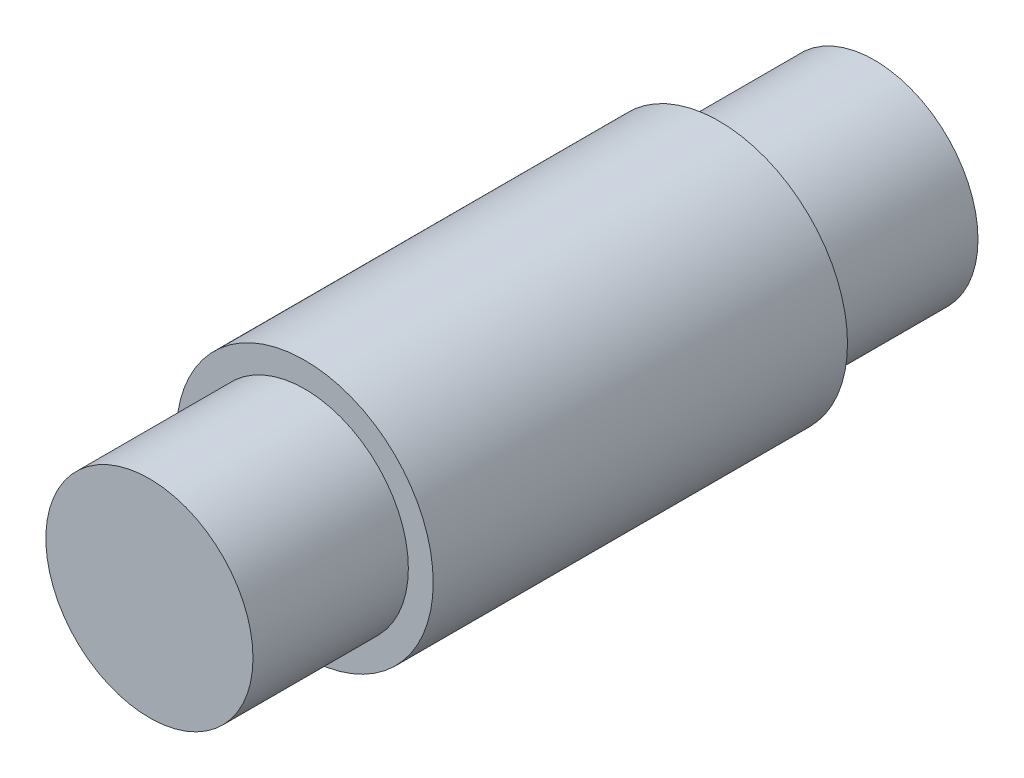
ISO-10303-21;
HEADER;
FILE_DESCRIPTION(('STEP AP214'),'2;1');
FILE_NAME('part.step','',(''),(''),'','','');
FILE_SCHEMA(('AUTOMOTIVE_DESIGN { 1 0 10303 214 1 1 1 1 }'));
ENDSEC;
DATA;
#1=APPLICATION_CONTEXT('core data for automotive mechanical design processes');
#2=APPLICATION_PROTOCOL_DEFINITION('international standard','automotive_design',2000,#1);
#3=PRODUCT_CONTEXT('',#1,'mechanical');
#4=PRODUCT('Part','Part','',(#3));
#5=PRODUCT_RELATED_PRODUCT_CATEGORY('part','',(#4));
#6=PRODUCT_DEFINITION_FORMATION('','',#4);
#7=PRODUCT_DEFINITION_CONTEXT('part definition',#1,'design');
#8=PRODUCT_DEFINITION('design','',#6,#7);
#9=PRODUCT_DEFINITION_SHAPE('','',#8);
#10=(LENGTH_UNIT() NAMED_UNIT(*) SI_UNIT(.MILLI.,.METRE.));
#11=(NAMED_UNIT(*) PLANE_ANGLE_UNIT() SI_UNIT($,.RADIAN.));
#12=(NAMED_UNIT(*) SI_UNIT($,.STERADIAN.) SOLID_ANGLE_UNIT());
#13=UNCERTAINTY_MEASURE_WITH_UNIT(LENGTH_MEASURE(1.E-05),#10,'distance_accuracy_value','');
#14=(GEOMETRIC_REPRESENTATION_CONTEXT(3) GLOBAL_UNCERTAINTY_ASSIGNED_CONTEXT((#13)) GLOBAL_UNIT_ASSIGNED_CONTEXT((#10,
#11,#12)) REPRESENTATION_CONTEXT('',''));
#15=CARTESIAN_POINT('',(0.,0.,0.));
#16=DIRECTION('',(0.,0.,1.));
#17=DIRECTION('',(1.,0.,0.));
#18=AXIS2_PLACEMENT_3D('',#15,#16,#17);
#19=CARTESIAN_POINT('',(-3.175,0.,0.));
#20=DIRECTION('',(0.,0.,-1.));
#21=DIRECTION('',(-1.,0.,0.));
#22=AXIS2_PLACEMENT_3D('',#19,#20,#21);
#23=PLANE('',#22);
#24=CARTESIAN_POINT('',(-3.175,0.,0.));
#25=DIRECTION('',(0.,0.,1.));
#26=DIRECTION('',(1.,0.,0.));
#27=AXIS2_PLACEMENT_3D('',#24,#25,#26);
#28=CIRCLE('',#27,3.175);
#29=CARTESIAN_POINT('',(0.,0.,0.));
#30=VERTEX_POINT('',#29);
#31=EDGE_CURVE('E10',#30,#30,#28,.T.);
#32=ORIENTED_EDGE('',*,*,#31,.F.);
#33=EDGE_LOOP('',(#32));
#34=FACE_BOUND('',#33,.T.);
#35=ADVANCED_FACE('F31',(#34),#23,.T.);
#36=CARTESIAN_POINT('',(-3.175,0.,22.225));
#37=DIRECTION('',(0.,0.,1.));
#38=DIRECTION('',(1.,0.,0.));
#39=AXIS2_PLACEMENT_3D('',#36,#37,#38);
#40=CYLINDRICAL_SURFACE('',#39,3.175);
#41=ORIENTED_EDGE('',*,*,#31,.T.);
#42=EDGE_LOOP('',(#41));
#43=FACE_BOUND('',#42,.T.);
#44=CARTESIAN_POINT('',(-3.175,0.,4.7625));
#45=DIRECTION('',(0.,0.,1.));
#46=DIRECTION('',(1.,0.,0.));
#47=AXIS2_PLACEMENT_3D('',#44,#45,#46);
#48=CIRCLE('',#47,3.175);
#49=CARTESIAN_POINT('',(0.,0.,4.7625));
#50=VERTEX_POINT('',#49);
#51=EDGE_CURVE('E37',#50,#50,#48,.T.);
#52=ORIENTED_EDGE('',*,*,#51,.F.);
#53=EDGE_LOOP('',(#52));
#54=FACE_BOUND('',#53,.T.);
#55=ADVANCED_FACE('F73',(#43,#54),#40,.T.);
#56=CARTESIAN_POINT('',(0.,0.,4.7625));
#57=DIRECTION('',(0.,0.,-1.));
#58=DIRECTION('',(-1.,0.,0.));
#59=AXIS2_PLACEMENT_3D('',#56,#57,#58);
#60=PLANE('',#59);
#61=ORIENTED_EDGE('',*,*,#51,.T.);
#62=EDGE_LOOP('',(#61));
#63=FACE_BOUND('',#62,.T.);
#64=CARTESIAN_POINT('',(-3.175,0.,4.7625));
#65=DIRECTION('',(0.,0.,1.));
#66=DIRECTION('',(1.,0.,0.));
#67=AXIS2_PLACEMENT_3D('',#64,#65,#66);
#68=CIRCLE('',#67,3.937);
#69=CARTESIAN_POINT('',(0.762,0.,4.7625));
#70=VERTEX_POINT('',#69);
#71=EDGE_CURVE('E41',#70,#70,#68,.T.);
#72=ORIENTED_EDGE('',*,*,#71,.F.);
#73=EDGE_LOOP('',(#72));
#74=FACE_BOUND('',#73,.T.);
#75=ADVANCED_FACE('F78',(#63,#74),#60,.T.);
#76=CARTESIAN_POINT('',(-3.175,0.,22.225));
#77=DIRECTION('',(0.,0.,1.));
#78=DIRECTION('',(1.,0.,0.));
#79=AXIS2_PLACEMENT_3D('',#76,#77,#78);
#80=CYLINDRICAL_SURFACE('',#79,3.937);
#81=ORIENTED_EDGE('',*,*,#71,.T.);
#82=EDGE_LOOP('',(#81));
#83=FACE_BOUND('',#82,.T.);
#84=CARTESIAN_POINT('',(-3.175,0.,17.4625));
#85=DIRECTION('',(0.,0.,1.));
#86=DIRECTION('',(1.,0.,0.));
#87=AXIS2_PLACEMENT_3D('',#84,#85,#86);
#88=CIRCLE('',#87,3.937);
#89=CARTESIAN_POINT('',(0.762000000000001,0.,17.4625));
#90=VERTEX_POINT('',#89);
#91=EDGE_CURVE('E45',#90,#90,#88,.T.);
#92=ORIENTED_EDGE('',*,*,#91,.F.);
#93=EDGE_LOOP('',(#92));
#94=FACE_BOUND('',#93,.T.);
#95=ADVANCED_FACE('F69',(#83,#94),#80,.T.);
#96=CARTESIAN_POINT('',(0.762000000000001,0.,17.4625));
#97=DIRECTION('',(0.,0.,1.));
#98=DIRECTION('',(1.,0.,0.));
#99=AXIS2_PLACEMENT_3D('',#96,#97,#98);
#100=PLANE('',#99);
#101=ORIENTED_EDGE('',*,*,#91,.T.);
#102=EDGE_LOOP('',(#101));
#103=FACE_BOUND('',#102,.T.);
#104=CARTESIAN_POINT('',(-3.175,0.,17.4625));
#105=DIRECTION('',(0.,0.,1.));
#106=DIRECTION('',(1.,0.,0.));
#107=AXIS2_PLACEMENT_3D('',#104,#105,#106);
#108=CIRCLE('',#107,3.175);
#109=CARTESIAN_POINT('',(0.,0.,17.4625));
#110=VERTEX_POINT('',#109);
#111=EDGE_CURVE('E50',#110,#110,#108,.T.);
#112=ORIENTED_EDGE('',*,*,#111,.F.);
#113=EDGE_LOOP('',(#112));
#114=FACE_BOUND('',#113,.T.);
#115=ADVANCED_FACE('F61',(#103,#114),#100,.T.);
#116=CARTESIAN_POINT('',(-3.175,0.,22.225));
#117=DIRECTION('',(0.,0.,1.));
#118=DIRECTION('',(1.,0.,0.));
#119=AXIS2_PLACEMENT_3D('',#116,#117,#118);
#120=CYLINDRICAL_SURFACE('',#119,3.175);
#121=ORIENTED_EDGE('',*,*,#111,.T.);
#122=EDGE_LOOP('',(#121));
#123=FACE_BOUND('',#122,.T.);
#124=CARTESIAN_POINT('',(-3.175,0.,22.225));
#125=DIRECTION('',(0.,0.,1.));
#126=DIRECTION('',(1.,0.,0.));
#127=AXIS2_PLACEMENT_3D('',#124,#125,#126);
#128=CIRCLE('',#127,3.175);
#129=CARTESIAN_POINT('',(0.,0.,22.225));
#130=VERTEX_POINT('',#129);
#131=EDGE_CURVE('E53',#130,#130,#128,.T.);
#132=ORIENTED_EDGE('',*,*,#131,.F.);
#133=EDGE_LOOP('',(#132));
#134=FACE_BOUND('',#133,.T.);
#135=ADVANCED_FACE('F59',(#123,#134),#120,.T.);
#136=CARTESIAN_POINT('',(0.,0.,22.225));
#137=DIRECTION('',(0.,0.,1.));
#138=DIRECTION('',(1.,0.,0.));
#139=AXIS2_PLACEMENT_3D('',#136,#137,#138);
#140=PLANE('',#139);
#141=ORIENTED_EDGE('',*,*,#131,.T.);
#142=EDGE_LOOP('',(#141));
#143=FACE_BOUND('',#142,.T.);
#144=ADVANCED_FACE('F57',(#143),#140,.T.);
#145=CLOSED_SHELL('',(#35,#55,#75,#95,#115,#135,#144));
#146=MANIFOLD_SOLID_BREP('B2',#145);
#147=ADVANCED_BREP_SHAPE_REPRESENTATION('',(#18,#146),#14);
#148=SHAPE_DEFINITION_REPRESENTATION(#9,#147);
ENDSEC;
END-ISO-10303-21;
